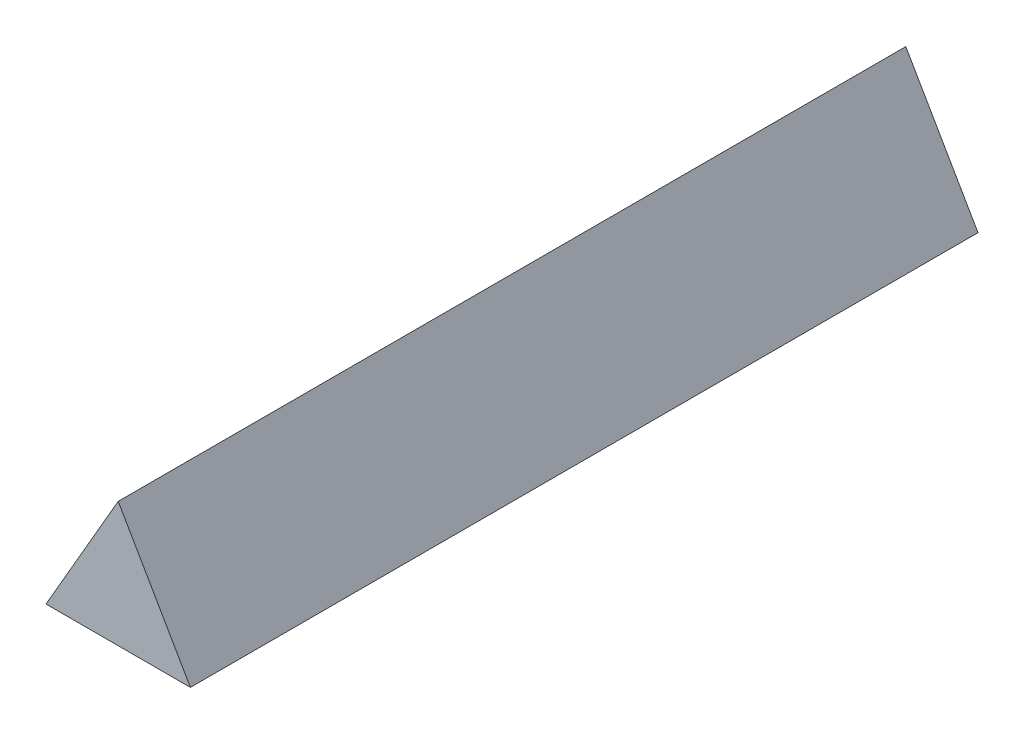
ISO-10303-21;
HEADER;
FILE_DESCRIPTION(('STEP AP214'),'2;1');
FILE_NAME('part.step','',(''),(''),'','','');
FILE_SCHEMA(('AUTOMOTIVE_DESIGN { 1 0 10303 214 1 1 1 1 }'));
ENDSEC;
DATA;
#1=APPLICATION_CONTEXT('core data for automotive mechanical design processes');
#2=APPLICATION_PROTOCOL_DEFINITION('international standard','automotive_design',2000,#1);
#3=PRODUCT_CONTEXT('',#1,'mechanical');
#4=PRODUCT('Part','Part','',(#3));
#5=PRODUCT_RELATED_PRODUCT_CATEGORY('part','',(#4));
#6=PRODUCT_DEFINITION_FORMATION('','',#4);
#7=PRODUCT_DEFINITION_CONTEXT('part definition',#1,'design');
#8=PRODUCT_DEFINITION('design','',#6,#7);
#9=PRODUCT_DEFINITION_SHAPE('','',#8);
#10=(LENGTH_UNIT() NAMED_UNIT(*) SI_UNIT(.MILLI.,.METRE.));
#11=(NAMED_UNIT(*) PLANE_ANGLE_UNIT() SI_UNIT($,.RADIAN.));
#12=(NAMED_UNIT(*) SI_UNIT($,.STERADIAN.) SOLID_ANGLE_UNIT());
#13=UNCERTAINTY_MEASURE_WITH_UNIT(LENGTH_MEASURE(1.E-05),#10,'distance_accuracy_value','');
#14=(GEOMETRIC_REPRESENTATION_CONTEXT(3) GLOBAL_UNCERTAINTY_ASSIGNED_CONTEXT((#13)) GLOBAL_UNIT_ASSIGNED_CONTEXT((#10,
#11,#12)) REPRESENTATION_CONTEXT('',''));
#15=CARTESIAN_POINT('',(0.,0.,0.));
#16=DIRECTION('',(0.,0.,1.));
#17=DIRECTION('',(1.,0.,0.));
#18=AXIS2_PLACEMENT_3D('',#15,#16,#17);
#19=CARTESIAN_POINT('',(-128.793834190231,108.09447868417,45.72));
#20=DIRECTION('',(-0.866025403784439,-0.5,0.));
#21=DIRECTION('',(0.5,-0.866025403784439,0.));
#22=AXIS2_PLACEMENT_3D('',#19,#20,#21);
#23=PLANE('',#22);
#24=DIRECTION('',(-0.5,0.866025403784439,0.));
#25=VECTOR('',#24,1.);
#26=CARTESIAN_POINT('',(-128.793834190231,108.09447868417,0.));
#27=LINE('',#26,#25);
#28=CARTESIAN_POINT('',(-128.793834190231,108.09447868417,0.));
#29=VERTEX_POINT('',#28);
#30=CARTESIAN_POINT('',(-132.984834190231,115.353503618691,0.));
#31=VERTEX_POINT('',#30);
#32=EDGE_CURVE('E95',#29,#31,#27,.T.);
#33=ORIENTED_EDGE('',*,*,#32,.T.);
#34=DIRECTION('',(0.,0.,-1.));
#35=VECTOR('',#34,1.);
#36=CARTESIAN_POINT('',(-132.984834190231,115.353503618691,45.72));
#37=LINE('',#36,#35);
#38=CARTESIAN_POINT('',(-132.984834190231,115.353503618691,45.72));
#39=VERTEX_POINT('',#38);
#40=EDGE_CURVE('E11',#39,#31,#37,.T.);
#41=ORIENTED_EDGE('',*,*,#40,.F.);
#42=DIRECTION('',(-0.5,0.866025403784439,0.));
#43=VECTOR('',#42,1.);
#44=CARTESIAN_POINT('',(-128.793834190231,108.09447868417,45.72));
#45=LINE('',#44,#43);
#46=CARTESIAN_POINT('',(-128.793834190231,108.09447868417,45.72));
#47=VERTEX_POINT('',#46);
#48=EDGE_CURVE('E87',#47,#39,#45,.T.);
#49=ORIENTED_EDGE('',*,*,#48,.F.);
#50=DIRECTION('',(0.,0.,-1.));
#51=VECTOR('',#50,1.);
#52=CARTESIAN_POINT('',(-128.793834190231,108.09447868417,45.72));
#53=LINE('',#52,#51);
#54=EDGE_CURVE('E96',#47,#29,#53,.T.);
#55=ORIENTED_EDGE('',*,*,#54,.T.);
#56=EDGE_LOOP('',(#33,#41,#49,#55));
#57=FACE_BOUND('',#56,.T.);
#58=ADVANCED_FACE('F39',(#57),#23,.F.);
#59=CARTESIAN_POINT('',(-132.984834190231,115.353503618691,45.72));
#60=DIRECTION('',(0.866025403784439,-0.5,0.));
#61=DIRECTION('',(0.5,0.866025403784439,0.));
#62=AXIS2_PLACEMENT_3D('',#59,#60,#61);
#63=PLANE('',#62);
#64=CARTESIAN_POINT('',(-135.080334190231,111.723991151431,4.));
#65=DIRECTION('',(-0.866025403784439,0.5,0.));
#66=DIRECTION('',(-0.5,-0.866025403784439,0.));
#67=AXIS2_PLACEMENT_3D('',#64,#65,#66);
#68=CIRCLE('',#67,1.27);
#69=CARTESIAN_POINT('',(-135.715334190231,110.624138888624,4.));
#70=VERTEX_POINT('',#69);
#71=EDGE_CURVE('E139',#70,#70,#68,.T.);
#72=ORIENTED_EDGE('',*,*,#71,.F.);
#73=EDGE_LOOP('',(#72));
#74=FACE_BOUND('',#73,.T.);
#75=DIRECTION('',(-0.5,-0.866025403784439,0.));
#76=VECTOR('',#75,1.);
#77=CARTESIAN_POINT('',(-132.984834190231,115.353503618691,0.));
#78=LINE('',#77,#76);
#79=CARTESIAN_POINT('',(-137.175834190231,108.09447868417,0.));
#80=VERTEX_POINT('',#79);
#81=EDGE_CURVE('E74',#31,#80,#78,.T.);
#82=ORIENTED_EDGE('',*,*,#81,.T.);
#83=DIRECTION('',(0.,0.,-1.));
#84=VECTOR('',#83,1.);
#85=CARTESIAN_POINT('',(-137.175834190231,108.09447868417,45.72));
#86=LINE('',#85,#84);
#87=CARTESIAN_POINT('',(-137.175834190231,108.09447868417,45.72));
#88=VERTEX_POINT('',#87);
#89=EDGE_CURVE('E54',#88,#80,#86,.T.);
#90=ORIENTED_EDGE('',*,*,#89,.F.);
#91=DIRECTION('',(-0.5,-0.866025403784439,0.));
#92=VECTOR('',#91,1.);
#93=CARTESIAN_POINT('',(-132.984834190231,115.353503618691,45.72));
#94=LINE('',#93,#92);
#95=EDGE_CURVE('E82',#39,#88,#94,.T.);
#96=ORIENTED_EDGE('',*,*,#95,.F.);
#97=ORIENTED_EDGE('',*,*,#40,.T.);
#98=EDGE_LOOP('',(#82,#90,#96,#97));
#99=FACE_BOUND('',#98,.T.);
#100=ADVANCED_FACE('F83',(#74,#99),#63,.F.);
#101=CARTESIAN_POINT('',(-137.175834190231,108.09447868417,45.72));
#102=DIRECTION('',(0.,1.,0.));
#103=DIRECTION('',(0.,0.,1.));
#104=AXIS2_PLACEMENT_3D('',#101,#102,#103);
#105=PLANE('',#104);
#106=DIRECTION('',(1.,0.,0.));
#107=VECTOR('',#106,1.);
#108=CARTESIAN_POINT('',(-137.175834190231,108.09447868417,0.));
#109=LINE('',#108,#107);
#110=EDGE_CURVE('E79',#80,#29,#109,.T.);
#111=ORIENTED_EDGE('',*,*,#110,.T.);
#112=ORIENTED_EDGE('',*,*,#54,.F.);
#113=DIRECTION('',(1.,0.,0.));
#114=VECTOR('',#113,1.);
#115=CARTESIAN_POINT('',(-137.175834190231,108.09447868417,45.72));
#116=LINE('',#115,#114);
#117=EDGE_CURVE('E62',#88,#47,#116,.T.);
#118=ORIENTED_EDGE('',*,*,#117,.F.);
#119=ORIENTED_EDGE('',*,*,#89,.T.);
#120=EDGE_LOOP('',(#111,#112,#118,#119));
#121=FACE_BOUND('',#120,.T.);
#122=ADVANCED_FACE('F114',(#121),#105,.F.);
#123=CARTESIAN_POINT('',(0.,0.,45.72));
#124=DIRECTION('',(0.,0.,1.));
#125=DIRECTION('',(1.,0.,0.));
#126=AXIS2_PLACEMENT_3D('',#123,#124,#125);
#127=PLANE('',#126);
#128=ORIENTED_EDGE('',*,*,#48,.T.);
#129=ORIENTED_EDGE('',*,*,#95,.T.);
#130=ORIENTED_EDGE('',*,*,#117,.T.);
#131=EDGE_LOOP('',(#128,#129,#130));
#132=FACE_BOUND('',#131,.T.);
#133=ADVANCED_FACE('F90',(#132),#127,.T.);
#134=CARTESIAN_POINT('',(0.,0.,0.));
#135=DIRECTION('',(0.,0.,1.));
#136=DIRECTION('',(1.,0.,0.));
#137=AXIS2_PLACEMENT_3D('',#134,#135,#136);
#138=PLANE('',#137);
#139=CARTESIAN_POINT('',(-132.984834190231,110.514153662344,0.));
#140=DIRECTION('',(0.,0.,-1.));
#141=DIRECTION('',(-1.,0.,0.));
#142=AXIS2_PLACEMENT_3D('',#139,#140,#141);
#143=CIRCLE('',#142,2.);
#144=CARTESIAN_POINT('',(-134.984834190231,110.514153662344,0.));
#145=VERTEX_POINT('',#144);
#146=EDGE_CURVE('E105',#145,#145,#143,.T.);
#147=ORIENTED_EDGE('',*,*,#146,.F.);
#148=EDGE_LOOP('',(#147));
#149=FACE_BOUND('',#148,.T.);
#150=ORIENTED_EDGE('',*,*,#32,.F.);
#151=ORIENTED_EDGE('',*,*,#110,.F.);
#152=ORIENTED_EDGE('',*,*,#81,.F.);
#153=EDGE_LOOP('',(#150,#151,#152));
#154=FACE_BOUND('',#153,.T.);
#155=ADVANCED_FACE('F115',(#149,#154),#138,.F.);
#156=CARTESIAN_POINT('',(-132.984834190231,110.514153662344,8.));
#157=DIRECTION('',(0.,0.,-1.));
#158=DIRECTION('',(-1.,0.,0.));
#159=AXIS2_PLACEMENT_3D('',#156,#157,#158);
#160=CYLINDRICAL_SURFACE('',#159,2.);
#161=CARTESIAN_POINT('',(-134.984834190231,110.514153662344,4.78287930104199));
#162=CARTESIAN_POINT('',(-134.984834627345,110.565421423173,4.83958887517132));
#163=CARTESIAN_POINT('',(-134.982853933954,110.620987602277,4.89240670661547));
#164=CARTESIAN_POINT('',(-134.973057123324,110.738785141627,4.98933347032785));
#165=CARTESIAN_POINT('',(-134.965244213936,110.801012821786,5.03344717320694));
#166=CARTESIAN_POINT('',(-134.942096681987,110.930668726124,5.11197262201537));
#167=CARTESIAN_POINT('',(-134.926713542145,110.998128098819,5.14631950201773));
#168=CARTESIAN_POINT('',(-134.88722609922,111.135429662356,5.20324448760675));
#169=CARTESIAN_POINT('',(-134.863132290761,111.205268894619,5.22583667570789));
#170=CARTESIAN_POINT('',(-134.809213212762,111.336396913438,5.2559537303106));
#171=CARTESIAN_POINT('',(-134.78035183044,111.397754539733,5.26490034423879));
#172=CARTESIAN_POINT('',(-134.716195175397,111.517647688222,5.27181324765576));
#173=CARTESIAN_POINT('',(-134.680903658039,111.576184832551,5.26978592646557));
#174=CARTESIAN_POINT('',(-134.609310321035,111.682374959873,5.25570618019278));
#175=CARTESIAN_POINT('',(-134.573517195285,111.730523011892,5.24474541779328));
#176=CARTESIAN_POINT('',(-134.499181037181,111.821909059706,5.21474321394668));
#177=CARTESIAN_POINT('',(-134.460637599967,111.865146330166,5.19570058074964));
#178=CARTESIAN_POINT('',(-134.380474370465,111.947908365294,5.14932556170265));
#179=CARTESIAN_POINT('',(-134.338793646007,111.987191049515,5.12166969753446));
#180=CARTESIAN_POINT('',(-134.255434443006,112.059673271535,5.0593259075603));
#181=CARTESIAN_POINT('',(-134.213755969945,112.092870756743,5.02463561726195));
#182=CARTESIAN_POINT('',(-134.125941580277,112.157705058635,4.94358133989464));
#183=CARTESIAN_POINT('',(-134.080022951559,112.188436263485,4.89625683254037));
#184=CARTESIAN_POINT('',(-133.992131950423,112.242744912279,4.794246179398));
#185=CARTESIAN_POINT('',(-133.950166613742,112.266309762189,4.73954731466433));
#186=CARTESIAN_POINT('',(-133.8685609783,112.308968137624,4.61729726330233));
#187=CARTESIAN_POINT('',(-133.829639598973,112.327322132731,4.54899822186859));
#188=CARTESIAN_POINT('',(-133.763885537863,112.356541115594,4.40539605240923));
#189=CARTESIAN_POINT('',(-133.737014799981,112.36742973754,4.3301158928394));
#190=CARTESIAN_POINT('',(-133.705156206341,112.379986861244,4.19804382768297));
#191=CARTESIAN_POINT('',(-133.696036838827,112.383434443542,4.14241256949654));
#192=CARTESIAN_POINT('',(-133.686809926017,112.386921363684,4.03032008639144));
#193=CARTESIAN_POINT('',(-133.686694108685,112.386963829987,3.97385967097574));
#194=CARTESIAN_POINT('',(-133.695475300407,112.383647711562,3.86183189008254));
#195=CARTESIAN_POINT('',(-133.704361964344,112.380293030636,3.80626357391625));
#196=CARTESIAN_POINT('',(-133.730167876121,112.370134777335,3.69733078572892));
#197=CARTESIAN_POINT('',(-133.747097555204,112.363326725394,3.64396927375999));
#198=CARTESIAN_POINT('',(-133.793463202073,112.343613012913,3.52524123585072));
#199=CARTESIAN_POINT('',(-133.825110540886,112.329504871233,3.46094144077398));
#200=CARTESIAN_POINT('',(-133.896203925149,112.294874754868,3.33869783522413));
#201=CARTESIAN_POINT('',(-133.935660202557,112.274344344448,3.28076252060364));
#202=CARTESIAN_POINT('',(-134.020234225412,112.225980623065,3.17119288658883));
#203=CARTESIAN_POINT('',(-134.065420427393,112.198053612302,3.11965285410837));
#204=CARTESIAN_POINT('',(-134.158677226514,112.134425113968,3.02458130347415));
#205=CARTESIAN_POINT('',(-134.206747828307,112.098723613855,2.98104979823971));
#206=CARTESIAN_POINT('',(-134.307317692978,112.016016243384,2.90008657610066));
#207=CARTESIAN_POINT('',(-134.359872282039,111.968350309012,2.86338551775214));
#208=CARTESIAN_POINT('',(-134.462783177123,111.863609061962,2.80240862734798));
#209=CARTESIAN_POINT('',(-134.513142265663,111.806546124776,2.77811662337783));
#210=CARTESIAN_POINT('',(-134.602139158749,111.692636965303,2.74596244703274));
#211=CARTESIAN_POINT('',(-134.641440155132,111.636812507625,2.73631782150804));
#212=CARTESIAN_POINT('',(-134.714366788402,111.52082937244,2.7281738516914));
#213=CARTESIAN_POINT('',(-134.747996365676,111.460673745951,2.72966673639114));
#214=CARTESIAN_POINT('',(-134.805005260022,111.3452102379,2.74287759417368));
#215=CARTESIAN_POINT('',(-134.829112719624,111.290120321607,2.75342393269136));
#216=CARTESIAN_POINT('',(-134.871690024677,111.179934678396,2.78264845142872));
#217=CARTESIAN_POINT('',(-134.890159051467,111.124838951795,2.8013278115517));
#218=CARTESIAN_POINT('',(-134.922266348783,111.013974450829,2.8469337408647));
#219=CARTESIAN_POINT('',(-134.935684290507,110.95826546284,2.87415768092828));
#220=CARTESIAN_POINT('',(-134.957242171528,110.84981492445,2.93564460117289));
#221=CARTESIAN_POINT('',(-134.96538041192,110.797074334201,2.96990984244067));
#222=CARTESIAN_POINT('',(-134.978073906777,110.688482620161,3.05001436848048));
#223=CARTESIAN_POINT('',(-134.981955267947,110.63325529615,3.09680655772315));
#224=CARTESIAN_POINT('',(-134.985447376374,110.529665457092,3.19773453377728));
#225=CARTESIAN_POINT('',(-134.985050691245,110.481315037164,3.25188293962881));
#226=CARTESIAN_POINT('',(-134.981479532868,110.388507815741,3.37315617778047));
#227=CARTESIAN_POINT('',(-134.978005451333,110.345058158755,3.44105275734183));
#228=CARTESIAN_POINT('',(-134.970484997458,110.272183679204,3.58391932779341));
#229=CARTESIAN_POINT('',(-134.966440410329,110.242716313405,3.658867019735));
#230=CARTESIAN_POINT('',(-134.961223515945,110.207394552703,3.79060608247535));
#231=CARTESIAN_POINT('',(-134.959555287319,110.197131277196,3.84619977033348));
#232=CARTESIAN_POINT('',(-134.9577563086,110.186107807554,3.95832529330849));
#233=CARTESIAN_POINT('',(-134.95762400785,110.185338028824,4.01485612452335));
#234=CARTESIAN_POINT('',(-134.958942903793,110.193360190777,4.12715010457335));
#235=CARTESIAN_POINT('',(-134.960392757744,110.202144023484,4.18291386376502));
#236=CARTESIAN_POINT('',(-134.964372073912,110.22849110845,4.29231117494979));
#237=CARTESIAN_POINT('',(-134.966903014333,110.246066387185,4.34594169994366));
#238=CARTESIAN_POINT('',(-134.973166780468,110.296473991666,4.46873187955441));
#239=CARTESIAN_POINT('',(-134.977005212418,110.332517100145,4.53656647966492));
#240=CARTESIAN_POINT('',(-134.982840364638,110.415636822308,4.6652074013939));
#241=CARTESIAN_POINT('',(-134.984833751815,110.462733212274,4.72600083048162));
#242=CARTESIAN_POINT('',(-134.984834190231,110.514153662344,4.78287930104199));
#243=B_SPLINE_CURVE_WITH_KNOTS('',3,(#161,#162,#163,#164,#165,#166,#167,#168,#169,#170,#171,
#172,#173,#174,#175,#176,#177,#178,#179,#180,#181,#182,#183,#184,#185,#186,#187,#188,#189,#190,
#191,#192,#193,#194,#195,#196,#197,#198,#199,#200,#201,#202,#203,#204,#205,#206,#207,#208,#209,
#210,#211,#212,#213,#214,#215,#216,#217,#218,#219,#220,#221,#222,#223,#224,#225,#226,#227,#228,
#229,#230,#231,#232,#233,#234,#235,#236,#237,#238,#239,#240,#241,#242),.UNSPECIFIED.,.T.,.F.,(4,
2,2,2,2,2,2,2,2,2,2,2,2,2,2,2,2,2,2,2,2,2,2,2,2,2,2,2,2,2,2,2,2,2,2,2,2,2,2,2,4),(0.,
0.229096771896491,0.458067628127899,0.688525444584952,0.918706525409981,1.12270076759329,
1.32657625160632,1.50871960288505,1.69088982229764,1.88095445597127,2.0710830825772,
2.28846162734396,2.50622001090784,2.74707907431327,2.98717205069299,3.15585436295875,
3.3243816960682,3.49271558698221,3.66126839397649,3.87923487419711,4.0974888669906,
4.31865219065924,4.53981587110436,4.77805880530975,5.01599045574159,5.22162873719404,
5.42712355145906,5.60945315528964,5.79180921952214,5.98138856761955,6.17102888840787,
6.38763061664925,6.60460871454001,6.84536178646002,7.08537755753671,7.25429982053999,
7.42305152638652,7.59166012741737,7.76050001411682,7.98986555116275,8.21964463513321),.UNSPECIFIED.);
#244=CARTESIAN_POINT('',(-134.984834190231,110.514153662344,4.78287930104199));
#245=VERTEX_POINT('',#244);
#246=EDGE_CURVE('E42',#245,#245,#243,.T.);
#247=ORIENTED_EDGE('',*,*,#246,.T.);
#248=EDGE_LOOP('',(#247));
#249=FACE_BOUND('',#248,.T.);
#250=CARTESIAN_POINT('',(-132.984834190231,110.514153662344,8.));
#251=DIRECTION('',(0.,0.,-1.));
#252=DIRECTION('',(-1.,0.,0.));
#253=AXIS2_PLACEMENT_3D('',#250,#251,#252);
#254=CIRCLE('',#253,2.);
#255=CARTESIAN_POINT('',(-134.984834190231,110.514153662344,8.));
#256=VERTEX_POINT('',#255);
#257=EDGE_CURVE('E99',#256,#256,#254,.T.);
#258=ORIENTED_EDGE('',*,*,#257,.F.);
#259=EDGE_LOOP('',(#258));
#260=FACE_BOUND('',#259,.T.);
#261=ORIENTED_EDGE('',*,*,#146,.T.);
#262=EDGE_LOOP('',(#261));
#263=FACE_BOUND('',#262,.T.);
#264=ADVANCED_FACE('F117',(#249,#260,#263),#160,.F.);
#265=CARTESIAN_POINT('',(-132.984834190231,110.514153662344,8.));
#266=DIRECTION('',(0.,0.,-1.));
#267=DIRECTION('',(-1.,0.,0.));
#268=AXIS2_PLACEMENT_3D('',#265,#266,#267);
#269=PLANE('',#268);
#270=ORIENTED_EDGE('',*,*,#257,.T.);
#271=EDGE_LOOP('',(#270));
#272=FACE_BOUND('',#271,.T.);
#273=ADVANCED_FACE('F124',(#272),#269,.T.);
#274=CARTESIAN_POINT('',(-132.880629664619,110.453991151431,4.));
#275=DIRECTION('',(-0.866025403784439,0.5,0.));
#276=DIRECTION('',(-0.5,-0.866025403784439,0.));
#277=AXIS2_PLACEMENT_3D('',#274,#275,#276);
#278=CYLINDRICAL_SURFACE('',#277,1.27);
#279=ORIENTED_EDGE('',*,*,#71,.T.);
#280=EDGE_LOOP('',(#279));
#281=FACE_BOUND('',#280,.T.);
#282=ORIENTED_EDGE('',*,*,#246,.F.);
#283=EDGE_LOOP('',(#282));
#284=FACE_BOUND('',#283,.T.);
#285=ADVANCED_FACE('F152',(#281,#284),#278,.F.);
#286=CLOSED_SHELL('',(#58,#100,#122,#133,#155,#264,#273,#285));
#287=MANIFOLD_SOLID_BREP('B2',#286);
#288=ADVANCED_BREP_SHAPE_REPRESENTATION('',(#18,#287),#14);
#289=SHAPE_DEFINITION_REPRESENTATION(#9,#288);
ENDSEC;
END-ISO-10303-21;
